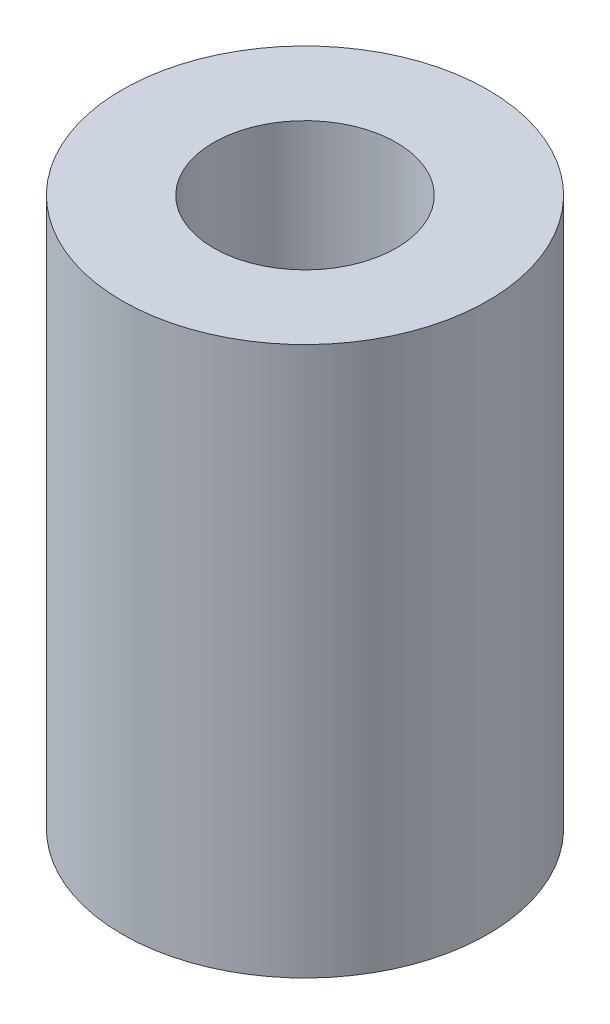
ISO-10303-21;
HEADER;
FILE_DESCRIPTION(('STEP AP214'),'2;1');
FILE_NAME('part.step','',(''),(''),'','','');
FILE_SCHEMA(('AUTOMOTIVE_DESIGN { 1 0 10303 214 1 1 1 1 }'));
ENDSEC;
DATA;
#1=APPLICATION_CONTEXT('core data for automotive mechanical design processes');
#2=APPLICATION_PROTOCOL_DEFINITION('international standard','automotive_design',2000,#1);
#3=PRODUCT_CONTEXT('',#1,'mechanical');
#4=PRODUCT('Part','Part','',(#3));
#5=PRODUCT_RELATED_PRODUCT_CATEGORY('part','',(#4));
#6=PRODUCT_DEFINITION_FORMATION('','',#4);
#7=PRODUCT_DEFINITION_CONTEXT('part definition',#1,'design');
#8=PRODUCT_DEFINITION('design','',#6,#7);
#9=PRODUCT_DEFINITION_SHAPE('','',#8);
#10=(LENGTH_UNIT() NAMED_UNIT(*) SI_UNIT(.MILLI.,.METRE.));
#11=(NAMED_UNIT(*) PLANE_ANGLE_UNIT() SI_UNIT($,.RADIAN.));
#12=(NAMED_UNIT(*) SI_UNIT($,.STERADIAN.) SOLID_ANGLE_UNIT());
#13=UNCERTAINTY_MEASURE_WITH_UNIT(LENGTH_MEASURE(1.E-05),#10,'distance_accuracy_value','');
#14=(GEOMETRIC_REPRESENTATION_CONTEXT(3) GLOBAL_UNCERTAINTY_ASSIGNED_CONTEXT((#13)) GLOBAL_UNIT_ASSIGNED_CONTEXT((#10,
#11,#12)) REPRESENTATION_CONTEXT('',''));
#15=CARTESIAN_POINT('',(0.,0.,0.));
#16=DIRECTION('',(0.,0.,1.));
#17=DIRECTION('',(1.,0.,0.));
#18=AXIS2_PLACEMENT_3D('',#15,#16,#17);
#19=CARTESIAN_POINT('',(0.,9.,0.));
#20=DIRECTION('',(0.,1.,0.));
#21=DIRECTION('',(0.,0.,1.));
#22=AXIS2_PLACEMENT_3D('',#19,#20,#21);
#23=PLANE('',#22);
#24=CARTESIAN_POINT('',(0.,9.,0.));
#25=DIRECTION('',(0.,1.,0.));
#26=DIRECTION('',(0.,0.,1.));
#27=AXIS2_PLACEMENT_3D('',#24,#25,#26);
#28=CIRCLE('',#27,3.);
#29=CARTESIAN_POINT('',(0.,9.,3.));
#30=VERTEX_POINT('',#29);
#31=EDGE_CURVE('E10',#30,#30,#28,.T.);
#32=ORIENTED_EDGE('',*,*,#31,.T.);
#33=EDGE_LOOP('',(#32));
#34=FACE_BOUND('',#33,.T.);
#35=CARTESIAN_POINT('',(0.,9.,0.));
#36=DIRECTION('',(0.,1.,0.));
#37=DIRECTION('',(0.,0.,1.));
#38=AXIS2_PLACEMENT_3D('',#35,#36,#37);
#39=CIRCLE('',#38,1.5);
#40=CARTESIAN_POINT('',(0.,9.,1.5));
#41=VERTEX_POINT('',#40);
#42=EDGE_CURVE('E48',#41,#41,#39,.T.);
#43=ORIENTED_EDGE('',*,*,#42,.F.);
#44=EDGE_LOOP('',(#43));
#45=FACE_BOUND('',#44,.T.);
#46=ADVANCED_FACE('F37',(#34,#45),#23,.T.);
#47=CARTESIAN_POINT('',(0.,0.,0.));
#48=DIRECTION('',(0.,1.,0.));
#49=DIRECTION('',(0.,0.,1.));
#50=AXIS2_PLACEMENT_3D('',#47,#48,#49);
#51=PLANE('',#50);
#52=CARTESIAN_POINT('',(0.,0.,0.));
#53=DIRECTION('',(0.,1.,0.));
#54=DIRECTION('',(0.,0.,1.));
#55=AXIS2_PLACEMENT_3D('',#52,#53,#54);
#56=CIRCLE('',#55,3.);
#57=CARTESIAN_POINT('',(0.,0.,3.));
#58=VERTEX_POINT('',#57);
#59=EDGE_CURVE('E41',#58,#58,#56,.T.);
#60=ORIENTED_EDGE('',*,*,#59,.F.);
#61=EDGE_LOOP('',(#60));
#62=FACE_BOUND('',#61,.T.);
#63=CARTESIAN_POINT('',(0.,0.,0.));
#64=DIRECTION('',(0.,1.,0.));
#65=DIRECTION('',(0.,0.,1.));
#66=AXIS2_PLACEMENT_3D('',#63,#64,#65);
#67=CIRCLE('',#66,1.5);
#68=CARTESIAN_POINT('',(0.,0.,1.5));
#69=VERTEX_POINT('',#68);
#70=EDGE_CURVE('E50',#69,#69,#67,.T.);
#71=ORIENTED_EDGE('',*,*,#70,.T.);
#72=EDGE_LOOP('',(#71));
#73=FACE_BOUND('',#72,.T.);
#74=ADVANCED_FACE('F60',(#62,#73),#51,.F.);
#75=CARTESIAN_POINT('',(0.,9.,0.));
#76=DIRECTION('',(0.,-1.,0.));
#77=DIRECTION('',(0.,0.,-1.));
#78=AXIS2_PLACEMENT_3D('',#75,#76,#77);
#79=CYLINDRICAL_SURFACE('',#78,3.);
#80=ORIENTED_EDGE('',*,*,#31,.F.);
#81=EDGE_LOOP('',(#80));
#82=FACE_BOUND('',#81,.T.);
#83=ORIENTED_EDGE('',*,*,#59,.T.);
#84=EDGE_LOOP('',(#83));
#85=FACE_BOUND('',#84,.T.);
#86=ADVANCED_FACE('F39',(#82,#85),#79,.T.);
#87=CARTESIAN_POINT('',(0.,9.,0.));
#88=DIRECTION('',(0.,-1.,0.));
#89=DIRECTION('',(0.,0.,-1.));
#90=AXIS2_PLACEMENT_3D('',#87,#88,#89);
#91=CYLINDRICAL_SURFACE('',#90,1.5);
#92=ORIENTED_EDGE('',*,*,#42,.T.);
#93=EDGE_LOOP('',(#92));
#94=FACE_BOUND('',#93,.T.);
#95=ORIENTED_EDGE('',*,*,#70,.F.);
#96=EDGE_LOOP('',(#95));
#97=FACE_BOUND('',#96,.T.);
#98=ADVANCED_FACE('F56',(#94,#97),#91,.F.);
#99=CLOSED_SHELL('',(#46,#74,#86,#98));
#100=MANIFOLD_SOLID_BREP('B2',#99);
#101=ADVANCED_BREP_SHAPE_REPRESENTATION('',(#18,#100),#14);
#102=SHAPE_DEFINITION_REPRESENTATION(#9,#101);
ENDSEC;
END-ISO-10303-21;
